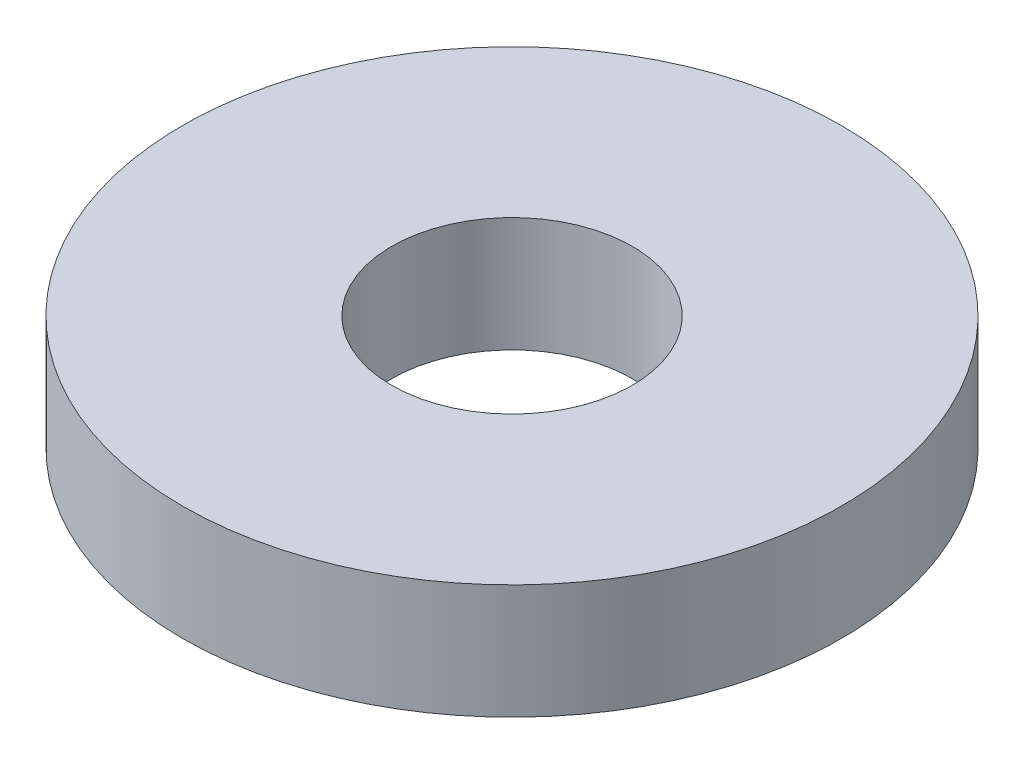
ISO-10303-21;
HEADER;
FILE_DESCRIPTION(('STEP AP214'),'2;1');
FILE_NAME('part.step','',(''),(''),'','','');
FILE_SCHEMA(('AUTOMOTIVE_DESIGN { 1 0 10303 214 1 1 1 1 }'));
ENDSEC;
DATA;
#1=APPLICATION_CONTEXT('core data for automotive mechanical design processes');
#2=APPLICATION_PROTOCOL_DEFINITION('international standard','automotive_design',2000,#1);
#3=PRODUCT_CONTEXT('',#1,'mechanical');
#4=PRODUCT('Part','Part','',(#3));
#5=PRODUCT_RELATED_PRODUCT_CATEGORY('part','',(#4));
#6=PRODUCT_DEFINITION_FORMATION('','',#4);
#7=PRODUCT_DEFINITION_CONTEXT('part definition',#1,'design');
#8=PRODUCT_DEFINITION('design','',#6,#7);
#9=PRODUCT_DEFINITION_SHAPE('','',#8);
#10=(LENGTH_UNIT() NAMED_UNIT(*) SI_UNIT(.MILLI.,.METRE.));
#11=(NAMED_UNIT(*) PLANE_ANGLE_UNIT() SI_UNIT($,.RADIAN.));
#12=(NAMED_UNIT(*) SI_UNIT($,.STERADIAN.) SOLID_ANGLE_UNIT());
#13=UNCERTAINTY_MEASURE_WITH_UNIT(LENGTH_MEASURE(1.E-05),#10,'distance_accuracy_value','');
#14=(GEOMETRIC_REPRESENTATION_CONTEXT(3) GLOBAL_UNCERTAINTY_ASSIGNED_CONTEXT((#13)) GLOBAL_UNIT_ASSIGNED_CONTEXT((#10,
#11,#12)) REPRESENTATION_CONTEXT('',''));
#15=CARTESIAN_POINT('',(0.,0.,0.));
#16=DIRECTION('',(0.,0.,1.));
#17=DIRECTION('',(1.,0.,0.));
#18=AXIS2_PLACEMENT_3D('',#15,#16,#17);
#19=CARTESIAN_POINT('',(0.,2.,0.));
#20=DIRECTION('',(0.,1.,0.));
#21=DIRECTION('',(0.,0.,1.));
#22=AXIS2_PLACEMENT_3D('',#19,#20,#21);
#23=PLANE('',#22);
#24=CARTESIAN_POINT('',(0.,2.,0.));
#25=DIRECTION('',(0.,1.,0.));
#26=DIRECTION('',(0.,0.,1.));
#27=AXIS2_PLACEMENT_3D('',#24,#25,#26);
#28=CIRCLE('',#27,5.75);
#29=CARTESIAN_POINT('',(0.,2.,5.75));
#30=VERTEX_POINT('',#29);
#31=EDGE_CURVE('E10',#30,#30,#28,.T.);
#32=ORIENTED_EDGE('',*,*,#31,.T.);
#33=EDGE_LOOP('',(#32));
#34=FACE_BOUND('',#33,.T.);
#35=CARTESIAN_POINT('',(0.,2.,0.));
#36=DIRECTION('',(0.,1.,0.));
#37=DIRECTION('',(0.,0.,1.));
#38=AXIS2_PLACEMENT_3D('',#35,#36,#37);
#39=CIRCLE('',#38,2.1);
#40=CARTESIAN_POINT('',(0.,2.,2.1));
#41=VERTEX_POINT('',#40);
#42=EDGE_CURVE('E56',#41,#41,#39,.T.);
#43=ORIENTED_EDGE('',*,*,#42,.F.);
#44=EDGE_LOOP('',(#43));
#45=FACE_BOUND('',#44,.T.);
#46=ADVANCED_FACE('F43',(#34,#45),#23,.T.);
#47=CARTESIAN_POINT('',(0.,0.,0.));
#48=DIRECTION('',(0.,1.,0.));
#49=DIRECTION('',(0.,0.,1.));
#50=AXIS2_PLACEMENT_3D('',#47,#48,#49);
#51=PLANE('',#50);
#52=CARTESIAN_POINT('',(0.,0.,0.));
#53=DIRECTION('',(0.,1.,0.));
#54=DIRECTION('',(0.,0.,1.));
#55=AXIS2_PLACEMENT_3D('',#52,#53,#54);
#56=CIRCLE('',#55,5.75);
#57=CARTESIAN_POINT('',(0.,0.,5.75));
#58=VERTEX_POINT('',#57);
#59=EDGE_CURVE('E47',#58,#58,#56,.T.);
#60=ORIENTED_EDGE('',*,*,#59,.F.);
#61=EDGE_LOOP('',(#60));
#62=FACE_BOUND('',#61,.T.);
#63=CARTESIAN_POINT('',(0.,0.,0.));
#64=DIRECTION('',(0.,1.,0.));
#65=DIRECTION('',(0.,0.,1.));
#66=AXIS2_PLACEMENT_3D('',#63,#64,#65);
#67=CIRCLE('',#66,2.1);
#68=CARTESIAN_POINT('',(0.,0.,2.1));
#69=VERTEX_POINT('',#68);
#70=EDGE_CURVE('E58',#69,#69,#67,.T.);
#71=ORIENTED_EDGE('',*,*,#70,.T.);
#72=EDGE_LOOP('',(#71));
#73=FACE_BOUND('',#72,.T.);
#74=ADVANCED_FACE('F70',(#62,#73),#51,.F.);
#75=CARTESIAN_POINT('',(0.,2.,0.));
#76=DIRECTION('',(0.,-1.,0.));
#77=DIRECTION('',(0.,0.,-1.));
#78=AXIS2_PLACEMENT_3D('',#75,#76,#77);
#79=CYLINDRICAL_SURFACE('',#78,5.75);
#80=ORIENTED_EDGE('',*,*,#31,.F.);
#81=EDGE_LOOP('',(#80));
#82=FACE_BOUND('',#81,.T.);
#83=ORIENTED_EDGE('',*,*,#59,.T.);
#84=EDGE_LOOP('',(#83));
#85=FACE_BOUND('',#84,.T.);
#86=ADVANCED_FACE('F45',(#82,#85),#79,.T.);
#87=CARTESIAN_POINT('',(0.,2.,0.));
#88=DIRECTION('',(0.,-1.,0.));
#89=DIRECTION('',(0.,0.,-1.));
#90=AXIS2_PLACEMENT_3D('',#87,#88,#89);
#91=CYLINDRICAL_SURFACE('',#90,2.1);
#92=ORIENTED_EDGE('',*,*,#42,.T.);
#93=EDGE_LOOP('',(#92));
#94=FACE_BOUND('',#93,.T.);
#95=ORIENTED_EDGE('',*,*,#70,.F.);
#96=EDGE_LOOP('',(#95));
#97=FACE_BOUND('',#96,.T.);
#98=ADVANCED_FACE('F66',(#94,#97),#91,.F.);
#99=CLOSED_SHELL('',(#46,#74,#86,#98));
#100=MANIFOLD_SOLID_BREP('B2',#99);
#101=ADVANCED_BREP_SHAPE_REPRESENTATION('',(#18,#100),#14);
#102=SHAPE_DEFINITION_REPRESENTATION(#9,#101);
ENDSEC;
END-ISO-10303-21;
